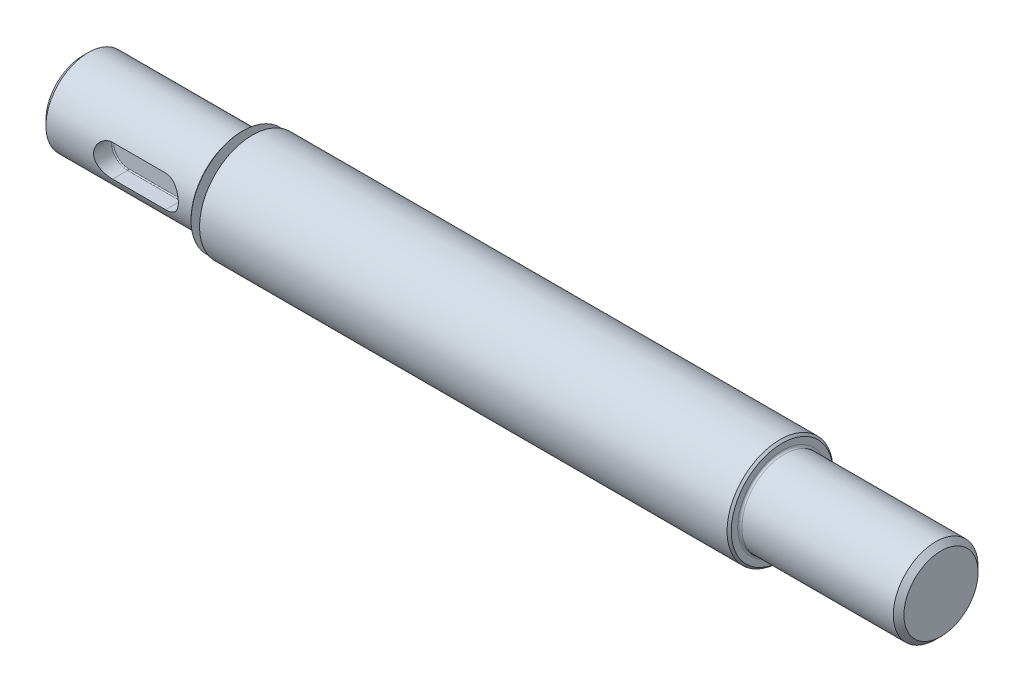
ISO-10303-21;
HEADER;
FILE_DESCRIPTION(('STEP AP214'),'2;1');
FILE_NAME('part.step','',(''),(''),'','','');
FILE_SCHEMA(('AUTOMOTIVE_DESIGN { 1 0 10303 214 1 1 1 1 }'));
ENDSEC;
DATA;
#1=APPLICATION_CONTEXT('core data for automotive mechanical design processes');
#2=APPLICATION_PROTOCOL_DEFINITION('international standard','automotive_design',2000,#1);
#3=PRODUCT_CONTEXT('',#1,'mechanical');
#4=PRODUCT('Part','Part','',(#3));
#5=PRODUCT_RELATED_PRODUCT_CATEGORY('part','',(#4));
#6=PRODUCT_DEFINITION_FORMATION('','',#4);
#7=PRODUCT_DEFINITION_CONTEXT('part definition',#1,'design');
#8=PRODUCT_DEFINITION('design','',#6,#7);
#9=PRODUCT_DEFINITION_SHAPE('','',#8);
#10=(LENGTH_UNIT() NAMED_UNIT(*) SI_UNIT(.MILLI.,.METRE.));
#11=(NAMED_UNIT(*) PLANE_ANGLE_UNIT() SI_UNIT($,.RADIAN.));
#12=(NAMED_UNIT(*) SI_UNIT($,.STERADIAN.) SOLID_ANGLE_UNIT());
#13=UNCERTAINTY_MEASURE_WITH_UNIT(LENGTH_MEASURE(1.E-05),#10,'distance_accuracy_value','');
#14=(GEOMETRIC_REPRESENTATION_CONTEXT(3) GLOBAL_UNCERTAINTY_ASSIGNED_CONTEXT((#13)) GLOBAL_UNIT_ASSIGNED_CONTEXT((#10,
#11,#12)) REPRESENTATION_CONTEXT('',''));
#15=CARTESIAN_POINT('',(0.,0.,0.));
#16=DIRECTION('',(0.,0.,1.));
#17=DIRECTION('',(1.,0.,0.));
#18=AXIS2_PLACEMENT_3D('',#15,#16,#17);
#19=CARTESIAN_POINT('',(0.,0.,0.));
#20=DIRECTION('',(-1.,0.,0.));
#21=DIRECTION('',(0.,0.,1.));
#22=AXIS2_PLACEMENT_3D('',#19,#20,#21);
#23=CYLINDRICAL_SURFACE('',#22,5.);
#24=CARTESIAN_POINT('',(65.8,0.,0.));
#25=DIRECTION('',(-1.,0.,0.));
#26=DIRECTION('',(0.,0.,1.));
#27=AXIS2_PLACEMENT_3D('',#24,#25,#26);
#28=CIRCLE('',#27,5.);
#29=CARTESIAN_POINT('',(65.8,0.,5.));
#30=VERTEX_POINT('',#29);
#31=EDGE_CURVE('E128',#30,#30,#28,.T.);
#32=ORIENTED_EDGE('',*,*,#31,.T.);
#33=EDGE_LOOP('',(#32));
#34=FACE_BOUND('',#33,.T.);
#35=CARTESIAN_POINT('',(16.,0.,0.));
#36=DIRECTION('',(-1.,0.,0.));
#37=DIRECTION('',(0.,0.,1.));
#38=AXIS2_PLACEMENT_3D('',#35,#36,#37);
#39=CIRCLE('',#38,5.);
#40=CARTESIAN_POINT('',(16.,0.,5.));
#41=VERTEX_POINT('',#40);
#42=EDGE_CURVE('E275',#41,#41,#39,.T.);
#43=ORIENTED_EDGE('',*,*,#42,.F.);
#44=EDGE_LOOP('',(#43));
#45=FACE_BOUND('',#44,.T.);
#46=ADVANCED_FACE('F37',(#34,#45),#23,.T.);
#47=CARTESIAN_POINT('',(81.,4.,0.));
#48=DIRECTION('',(-1.,0.,0.));
#49=DIRECTION('',(0.,0.,1.));
#50=AXIS2_PLACEMENT_3D('',#47,#48,#49);
#51=PLANE('',#50);
#52=CARTESIAN_POINT('',(81.,0.,0.));
#53=DIRECTION('',(-1.,0.,0.));
#54=DIRECTION('',(0.,0.,1.));
#55=AXIS2_PLACEMENT_3D('',#52,#53,#54);
#56=CIRCLE('',#55,3.5);
#57=CARTESIAN_POINT('',(81.,0.,3.5));
#58=VERTEX_POINT('',#57);
#59=EDGE_CURVE('E154',#58,#58,#56,.F.);
#60=ORIENTED_EDGE('',*,*,#59,.T.);
#61=EDGE_LOOP('',(#60));
#62=FACE_BOUND('',#61,.T.);
#63=ADVANCED_FACE('F219',(#62),#51,.F.);
#64=CARTESIAN_POINT('',(0.,0.,0.));
#65=DIRECTION('',(-1.,0.,0.));
#66=DIRECTION('',(0.,0.,1.));
#67=AXIS2_PLACEMENT_3D('',#64,#65,#66);
#68=CYLINDRICAL_SURFACE('',#67,4.);
#69=CARTESIAN_POINT('',(66.2,0.,0.));
#70=DIRECTION('',(-1.,0.,0.));
#71=DIRECTION('',(0.,0.,1.));
#72=AXIS2_PLACEMENT_3D('',#69,#70,#71);
#73=CIRCLE('',#72,4.);
#74=CARTESIAN_POINT('',(66.2,0.,4.));
#75=VERTEX_POINT('',#74);
#76=EDGE_CURVE('E166',#75,#75,#73,.F.);
#77=ORIENTED_EDGE('',*,*,#76,.T.);
#78=EDGE_LOOP('',(#77));
#79=FACE_BOUND('',#78,.T.);
#80=CARTESIAN_POINT('',(80.5,0.,0.));
#81=DIRECTION('',(-1.,0.,0.));
#82=DIRECTION('',(0.,0.,1.));
#83=AXIS2_PLACEMENT_3D('',#80,#81,#82);
#84=CIRCLE('',#83,4.);
#85=CARTESIAN_POINT('',(80.5,0.,4.));
#86=VERTEX_POINT('',#85);
#87=EDGE_CURVE('E151',#86,#86,#84,.T.);
#88=ORIENTED_EDGE('',*,*,#87,.T.);
#89=EDGE_LOOP('',(#88));
#90=FACE_BOUND('',#89,.T.);
#91=ADVANCED_FACE('F225',(#79,#90),#68,.T.);
#92=CARTESIAN_POINT('',(66.,4.,0.));
#93=DIRECTION('',(-1.,0.,0.));
#94=DIRECTION('',(0.,0.,1.));
#95=AXIS2_PLACEMENT_3D('',#92,#93,#94);
#96=PLANE('',#95);
#97=CARTESIAN_POINT('',(66.,0.,0.));
#98=DIRECTION('',(-1.,0.,0.));
#99=DIRECTION('',(0.,0.,1.));
#100=AXIS2_PLACEMENT_3D('',#97,#98,#99);
#101=CIRCLE('',#100,4.2);
#102=CARTESIAN_POINT('',(66.,0.,4.2));
#103=VERTEX_POINT('',#102);
#104=EDGE_CURVE('E163',#103,#103,#101,.T.);
#105=ORIENTED_EDGE('',*,*,#104,.T.);
#106=EDGE_LOOP('',(#105));
#107=FACE_BOUND('',#106,.T.);
#108=CARTESIAN_POINT('',(66.,0.,0.));
#109=DIRECTION('',(-1.,0.,0.));
#110=DIRECTION('',(0.,0.,1.));
#111=AXIS2_PLACEMENT_3D('',#108,#109,#110);
#112=CIRCLE('',#111,4.80000000000001);
#113=CARTESIAN_POINT('',(66.,0.,4.80000000000001));
#114=VERTEX_POINT('',#113);
#115=EDGE_CURVE('E139',#114,#114,#112,.F.);
#116=ORIENTED_EDGE('',*,*,#115,.T.);
#117=EDGE_LOOP('',(#116));
#118=FACE_BOUND('',#117,.T.);
#119=ADVANCED_FACE('F231',(#107,#118),#96,.F.);
#120=CARTESIAN_POINT('',(65.8,0.,0.));
#121=DIRECTION('',(-1.,0.,0.));
#122=DIRECTION('',(0.,0.,1.));
#123=AXIS2_PLACEMENT_3D('',#120,#121,#122);
#124=CONICAL_SURFACE('',#123,5.,0.785398163397427);
#125=ORIENTED_EDGE('',*,*,#115,.F.);
#126=EDGE_LOOP('',(#125));
#127=FACE_BOUND('',#126,.T.);
#128=ORIENTED_EDGE('',*,*,#31,.F.);
#129=EDGE_LOOP('',(#128));
#130=FACE_BOUND('',#129,.T.);
#131=ADVANCED_FACE('F234',(#127,#130),#124,.T.);
#132=CARTESIAN_POINT('',(80.5,0.,0.));
#133=DIRECTION('',(-1.,0.,0.));
#134=DIRECTION('',(0.,0.,1.));
#135=AXIS2_PLACEMENT_3D('',#132,#133,#134);
#136=CONICAL_SURFACE('',#135,4.,0.785398163397459);
#137=ORIENTED_EDGE('',*,*,#59,.F.);
#138=EDGE_LOOP('',(#137));
#139=FACE_BOUND('',#138,.T.);
#140=ORIENTED_EDGE('',*,*,#87,.F.);
#141=EDGE_LOOP('',(#140));
#142=FACE_BOUND('',#141,.T.);
#143=ADVANCED_FACE('F241',(#139,#142),#136,.T.);
#144=CARTESIAN_POINT('',(66.2,0.,0.));
#145=DIRECTION('',(-1.,0.,0.));
#146=DIRECTION('',(0.,0.,1.));
#147=AXIS2_PLACEMENT_3D('',#144,#145,#146);
#148=TOROIDAL_SURFACE('',#147,4.2,0.2);
#149=ORIENTED_EDGE('',*,*,#76,.F.);
#150=EDGE_LOOP('',(#149));
#151=FACE_BOUND('',#150,.T.);
#152=ORIENTED_EDGE('',*,*,#104,.F.);
#153=EDGE_LOOP('',(#152));
#154=FACE_BOUND('',#153,.T.);
#155=ADVANCED_FACE('F39',(#151,#154),#148,.F.);
#156=CARTESIAN_POINT('',(15.1,3.5,0.));
#157=DIRECTION('',(1.,0.,0.));
#158=DIRECTION('',(0.,0.,-1.));
#159=AXIS2_PLACEMENT_3D('',#156,#157,#158);
#160=PLANE('',#159);
#161=CARTESIAN_POINT('',(15.1,0.,0.));
#162=DIRECTION('',(1.,0.,0.));
#163=DIRECTION('',(0.,0.,-1.));
#164=AXIS2_PLACEMENT_3D('',#161,#162,#163);
#165=CIRCLE('',#164,4.89999999999999);
#166=CARTESIAN_POINT('',(15.1,0.,-4.89999999999999));
#167=VERTEX_POINT('',#166);
#168=EDGE_CURVE('E41',#167,#167,#165,.F.);
#169=ORIENTED_EDGE('',*,*,#168,.F.);
#170=EDGE_LOOP('',(#169));
#171=FACE_BOUND('',#170,.T.);
#172=CARTESIAN_POINT('',(15.1,0.,0.));
#173=DIRECTION('',(-1.,0.,0.));
#174=DIRECTION('',(0.,0.,1.));
#175=AXIS2_PLACEMENT_3D('',#172,#173,#174);
#176=CIRCLE('',#175,3.5);
#177=CARTESIAN_POINT('',(15.1,0.,3.5));
#178=VERTEX_POINT('',#177);
#179=EDGE_CURVE('E282',#178,#178,#176,.T.);
#180=ORIENTED_EDGE('',*,*,#179,.T.);
#181=EDGE_LOOP('',(#180));
#182=FACE_BOUND('',#181,.T.);
#183=ADVANCED_FACE('F379',(#171,#182),#160,.T.);
#184=CARTESIAN_POINT('',(16.,3.5,0.));
#185=DIRECTION('',(-1.,0.,0.));
#186=DIRECTION('',(0.,0.,1.));
#187=AXIS2_PLACEMENT_3D('',#184,#185,#186);
#188=PLANE('',#187);
#189=ORIENTED_EDGE('',*,*,#42,.T.);
#190=EDGE_LOOP('',(#189));
#191=FACE_BOUND('',#190,.T.);
#192=CARTESIAN_POINT('',(16.,0.,0.));
#193=DIRECTION('',(-1.,0.,0.));
#194=DIRECTION('',(0.,0.,1.));
#195=AXIS2_PLACEMENT_3D('',#192,#193,#194);
#196=CIRCLE('',#195,3.5);
#197=CARTESIAN_POINT('',(16.,0.,3.5));
#198=VERTEX_POINT('',#197);
#199=EDGE_CURVE('E277',#198,#198,#196,.T.);
#200=ORIENTED_EDGE('',*,*,#199,.F.);
#201=EDGE_LOOP('',(#200));
#202=FACE_BOUND('',#201,.T.);
#203=ADVANCED_FACE('F383',(#191,#202),#188,.T.);
#204=CARTESIAN_POINT('',(0.,0.,0.));
#205=DIRECTION('',(-1.,0.,0.));
#206=DIRECTION('',(0.,0.,1.));
#207=AXIS2_PLACEMENT_3D('',#204,#205,#206);
#208=CYLINDRICAL_SURFACE('',#207,3.5);
#209=ORIENTED_EDGE('',*,*,#199,.T.);
#210=EDGE_LOOP('',(#209));
#211=FACE_BOUND('',#210,.T.);
#212=ORIENTED_EDGE('',*,*,#179,.F.);
#213=EDGE_LOOP('',(#212));
#214=FACE_BOUND('',#213,.T.);
#215=ADVANCED_FACE('F216',(#211,#214),#208,.T.);
#216=CARTESIAN_POINT('',(0.,0.,2.2));
#217=DIRECTION('',(0.,0.,1.));
#218=DIRECTION('',(1.,0.,0.));
#219=AXIS2_PLACEMENT_3D('',#216,#217,#218);
#220=PLANE('',#219);
#221=DIRECTION('',(1.,0.,0.));
#222=VECTOR('',#221,1.);
#223=CARTESIAN_POINT('',(6.5,-1.4,2.2));
#224=LINE('',#223,#222);
#225=CARTESIAN_POINT('',(11.5,-1.4,2.2));
#226=VERTEX_POINT('',#225);
#227=CARTESIAN_POINT('',(6.5,-1.4,2.2));
#228=VERTEX_POINT('',#227);
#229=EDGE_CURVE('E117',#226,#228,#224,.F.);
#230=ORIENTED_EDGE('',*,*,#229,.F.);
#231=CARTESIAN_POINT('',(11.5,0.,2.2));
#232=DIRECTION('',(0.,0.,1.));
#233=DIRECTION('',(1.,0.,0.));
#234=AXIS2_PLACEMENT_3D('',#231,#232,#233);
#235=CIRCLE('',#234,1.4);
#236=CARTESIAN_POINT('',(11.5,1.4,2.2));
#237=VERTEX_POINT('',#236);
#238=EDGE_CURVE('E109',#237,#226,#235,.F.);
#239=ORIENTED_EDGE('',*,*,#238,.F.);
#240=DIRECTION('',(-1.,0.,0.));
#241=VECTOR('',#240,1.);
#242=CARTESIAN_POINT('',(11.5,1.4,2.2));
#243=LINE('',#242,#241);
#244=CARTESIAN_POINT('',(6.5,1.4,2.2));
#245=VERTEX_POINT('',#244);
#246=EDGE_CURVE('E94',#245,#237,#243,.F.);
#247=ORIENTED_EDGE('',*,*,#246,.F.);
#248=CARTESIAN_POINT('',(6.5,0.,2.2));
#249=DIRECTION('',(0.,0.,1.));
#250=DIRECTION('',(1.,0.,0.));
#251=AXIS2_PLACEMENT_3D('',#248,#249,#250);
#252=CIRCLE('',#251,1.4);
#253=EDGE_CURVE('E108',#228,#245,#252,.F.);
#254=ORIENTED_EDGE('',*,*,#253,.F.);
#255=EDGE_LOOP('',(#230,#239,#247,#254));
#256=FACE_BOUND('',#255,.T.);
#257=ADVANCED_FACE('F107',(#256),#220,.T.);
#258=CARTESIAN_POINT('',(0.,4.,0.));
#259=DIRECTION('',(1.,0.,0.));
#260=DIRECTION('',(0.,0.,-1.));
#261=AXIS2_PLACEMENT_3D('',#258,#259,#260);
#262=PLANE('',#261);
#263=CARTESIAN_POINT('',(0.,0.,0.));
#264=DIRECTION('',(1.,0.,0.));
#265=DIRECTION('',(0.,0.,-1.));
#266=AXIS2_PLACEMENT_3D('',#263,#264,#265);
#267=CIRCLE('',#266,3.50000000000002);
#268=CARTESIAN_POINT('',(0.,0.,-3.50000000000002));
#269=VERTEX_POINT('',#268);
#270=EDGE_CURVE('E145',#269,#269,#267,.F.);
#271=ORIENTED_EDGE('',*,*,#270,.T.);
#272=EDGE_LOOP('',(#271));
#273=FACE_BOUND('',#272,.T.);
#274=ADVANCED_FACE('F202',(#273),#262,.F.);
#275=CARTESIAN_POINT('',(6.5,0.,2.3));
#276=DIRECTION('',(0.,0.,1.));
#277=DIRECTION('',(1.,0.,0.));
#278=AXIS2_PLACEMENT_3D('',#275,#276,#277);
#279=TOROIDAL_SURFACE('',#278,1.4,0.1);
#280=CARTESIAN_POINT('',(6.5,-1.4,2.3));
#281=DIRECTION('',(-1.,0.,0.));
#282=DIRECTION('',(0.,0.,1.));
#283=AXIS2_PLACEMENT_3D('',#280,#281,#282);
#284=CIRCLE('',#283,0.1);
#285=CARTESIAN_POINT('',(6.5,-1.5,2.3));
#286=VERTEX_POINT('',#285);
#287=EDGE_CURVE('E102',#228,#286,#284,.T.);
#288=ORIENTED_EDGE('',*,*,#287,.F.);
#289=ORIENTED_EDGE('',*,*,#253,.T.);
#290=CARTESIAN_POINT('',(6.5,1.4,2.3));
#291=DIRECTION('',(-1.,0.,0.));
#292=DIRECTION('',(0.,0.,1.));
#293=AXIS2_PLACEMENT_3D('',#290,#291,#292);
#294=CIRCLE('',#293,0.1);
#295=CARTESIAN_POINT('',(6.5,1.5,2.3));
#296=VERTEX_POINT('',#295);
#297=EDGE_CURVE('E90',#296,#245,#294,.T.);
#298=ORIENTED_EDGE('',*,*,#297,.F.);
#299=CARTESIAN_POINT('',(6.5,0.,2.3));
#300=DIRECTION('',(0.,0.,1.));
#301=DIRECTION('',(1.,0.,0.));
#302=AXIS2_PLACEMENT_3D('',#299,#300,#301);
#303=CIRCLE('',#302,1.5);
#304=EDGE_CURVE('E116',#296,#286,#303,.T.);
#305=ORIENTED_EDGE('',*,*,#304,.T.);
#306=EDGE_LOOP('',(#288,#289,#298,#305));
#307=FACE_BOUND('',#306,.T.);
#308=ADVANCED_FACE('F114',(#307),#279,.F.);
#309=CARTESIAN_POINT('',(5.,-1.4,2.3));
#310=DIRECTION('',(-1.,0.,0.));
#311=DIRECTION('',(0.,-1.,0.));
#312=AXIS2_PLACEMENT_3D('',#309,#310,#311);
#313=CYLINDRICAL_SURFACE('',#312,0.1);
#314=CARTESIAN_POINT('',(11.5,-1.4,2.3));
#315=DIRECTION('',(-1.,0.,0.));
#316=DIRECTION('',(0.,0.,1.));
#317=AXIS2_PLACEMENT_3D('',#314,#315,#316);
#318=CIRCLE('',#317,0.1);
#319=CARTESIAN_POINT('',(11.5,-1.5,2.3));
#320=VERTEX_POINT('',#319);
#321=EDGE_CURVE('E133',#226,#320,#318,.T.);
#322=ORIENTED_EDGE('',*,*,#321,.F.);
#323=ORIENTED_EDGE('',*,*,#229,.T.);
#324=ORIENTED_EDGE('',*,*,#287,.T.);
#325=DIRECTION('',(1.,0.,0.));
#326=VECTOR('',#325,1.);
#327=CARTESIAN_POINT('',(11.5,-1.5,2.3));
#328=LINE('',#327,#326);
#329=EDGE_CURVE('E119',#286,#320,#328,.T.);
#330=ORIENTED_EDGE('',*,*,#329,.T.);
#331=EDGE_LOOP('',(#322,#323,#324,#330));
#332=FACE_BOUND('',#331,.T.);
#333=ADVANCED_FACE('F201',(#332),#313,.F.);
#334=CARTESIAN_POINT('',(11.5,0.,2.3));
#335=DIRECTION('',(0.,0.,1.));
#336=DIRECTION('',(1.,0.,0.));
#337=AXIS2_PLACEMENT_3D('',#334,#335,#336);
#338=TOROIDAL_SURFACE('',#337,1.4,0.1);
#339=CARTESIAN_POINT('',(11.5,1.4,2.3));
#340=DIRECTION('',(-1.,0.,0.));
#341=DIRECTION('',(0.,0.,1.));
#342=AXIS2_PLACEMENT_3D('',#339,#340,#341);
#343=CIRCLE('',#342,0.1);
#344=CARTESIAN_POINT('',(11.5,1.5,2.3));
#345=VERTEX_POINT('',#344);
#346=EDGE_CURVE('E131',#345,#237,#343,.T.);
#347=ORIENTED_EDGE('',*,*,#346,.T.);
#348=ORIENTED_EDGE('',*,*,#238,.T.);
#349=ORIENTED_EDGE('',*,*,#321,.T.);
#350=CARTESIAN_POINT('',(11.5,0.,2.3));
#351=DIRECTION('',(0.,0.,1.));
#352=DIRECTION('',(1.,0.,0.));
#353=AXIS2_PLACEMENT_3D('',#350,#351,#352);
#354=CIRCLE('',#353,1.5);
#355=EDGE_CURVE('E125',#320,#345,#354,.T.);
#356=ORIENTED_EDGE('',*,*,#355,.T.);
#357=EDGE_LOOP('',(#347,#348,#349,#356));
#358=FACE_BOUND('',#357,.T.);
#359=ADVANCED_FACE('F205',(#358),#338,.F.);
#360=CARTESIAN_POINT('',(5.,1.4,2.3));
#361=DIRECTION('',(1.,0.,0.));
#362=DIRECTION('',(0.,1.,0.));
#363=AXIS2_PLACEMENT_3D('',#360,#361,#362);
#364=CYLINDRICAL_SURFACE('',#363,0.1);
#365=ORIENTED_EDGE('',*,*,#346,.F.);
#366=DIRECTION('',(-1.,0.,0.));
#367=VECTOR('',#366,1.);
#368=CARTESIAN_POINT('',(6.5,1.5,2.3));
#369=LINE('',#368,#367);
#370=EDGE_CURVE('E97',#345,#296,#369,.T.);
#371=ORIENTED_EDGE('',*,*,#370,.T.);
#372=ORIENTED_EDGE('',*,*,#297,.T.);
#373=ORIENTED_EDGE('',*,*,#246,.T.);
#374=EDGE_LOOP('',(#365,#371,#372,#373));
#375=FACE_BOUND('',#374,.T.);
#376=ADVANCED_FACE('F93',(#375),#364,.F.);
#377=CARTESIAN_POINT('',(0.,0.,0.));
#378=DIRECTION('',(1.,0.,0.));
#379=DIRECTION('',(0.,0.,-1.));
#380=AXIS2_PLACEMENT_3D('',#377,#378,#379);
#381=CONICAL_SURFACE('',#380,3.50000000000002,0.785398163397435);
#382=CARTESIAN_POINT('',(0.499999999999995,0.,0.));
#383=DIRECTION('',(1.,0.,0.));
#384=DIRECTION('',(0.,0.,-1.));
#385=AXIS2_PLACEMENT_3D('',#382,#383,#384);
#386=CIRCLE('',#385,4.);
#387=CARTESIAN_POINT('',(0.499999999999995,0.,-4.));
#388=VERTEX_POINT('',#387);
#389=EDGE_CURVE('E148',#388,#388,#386,.T.);
#390=ORIENTED_EDGE('',*,*,#389,.F.);
#391=EDGE_LOOP('',(#390));
#392=FACE_BOUND('',#391,.T.);
#393=ORIENTED_EDGE('',*,*,#270,.F.);
#394=EDGE_LOOP('',(#393));
#395=FACE_BOUND('',#394,.T.);
#396=ADVANCED_FACE('F191',(#392,#395),#381,.T.);
#397=CARTESIAN_POINT('',(6.5,0.,2.2));
#398=DIRECTION('',(0.,0.,1.));
#399=DIRECTION('',(1.,0.,0.));
#400=AXIS2_PLACEMENT_3D('',#397,#398,#399);
#401=CYLINDRICAL_SURFACE('',#400,1.5);
#402=DIRECTION('',(0.,0.,1.));
#403=VECTOR('',#402,1.);
#404=CARTESIAN_POINT('',(6.5,-1.5,2.2));
#405=LINE('',#404,#403);
#406=CARTESIAN_POINT('',(6.5,-1.5,3.70809924354783));
#407=VERTEX_POINT('',#406);
#408=EDGE_CURVE('E288',#407,#286,#405,.F.);
#409=ORIENTED_EDGE('',*,*,#408,.T.);
#410=ORIENTED_EDGE('',*,*,#304,.F.);
#411=DIRECTION('',(0.,0.,1.));
#412=VECTOR('',#411,1.);
#413=CARTESIAN_POINT('',(6.5,1.5,2.2));
#414=LINE('',#413,#412);
#415=CARTESIAN_POINT('',(6.5,1.5,3.70809924354783));
#416=VERTEX_POINT('',#415);
#417=EDGE_CURVE('E136',#296,#416,#414,.T.);
#418=ORIENTED_EDGE('',*,*,#417,.T.);
#419=CARTESIAN_POINT('',(6.5,-1.5,3.70809924354783));
#420=CARTESIAN_POINT('',(6.45940746697043,-1.50000149729856,3.70809443619347));
#421=CARTESIAN_POINT('',(6.41883607071224,-1.49835118206537,3.70876663375751));
#422=CARTESIAN_POINT('',(6.33801546127266,-1.49177905295192,3.71141673218275));
#423=CARTESIAN_POINT('',(6.29776614450681,-1.48685833749724,3.7133941946446));
#424=CARTESIAN_POINT('',(6.17823278427476,-1.46729482367934,3.72118975606221));
#425=CARTESIAN_POINT('',(6.09980033977284,-1.44784998767984,3.72887188404209));
#426=CARTESIAN_POINT('',(5.94763248148488,-1.39690233043372,3.74825217997877));
#427=CARTESIAN_POINT('',(5.87389317095925,-1.36540966903062,3.7599469632381));
#428=CARTESIAN_POINT('',(5.73266647993866,-1.29134097725474,3.7860238820009));
#429=CARTESIAN_POINT('',(5.66518427798758,-1.24875587557702,3.80040821426565));
#430=CARTESIAN_POINT('',(5.53510808005929,-1.15146603872017,3.83103589828726));
#431=CARTESIAN_POINT('',(5.47286998568183,-1.09630269892843,3.84733374054252));
#432=CARTESIAN_POINT('',(5.35827640698257,-0.976394584974256,3.8794978206844));
#433=CARTESIAN_POINT('',(5.3059228356596,-0.911647960429701,3.8953639745168));
#434=CARTESIAN_POINT('',(5.21085978574637,-0.771693719740036,3.92552893891844));
#435=CARTESIAN_POINT('',(5.1685393993163,-0.696204968758628,3.93975598379754));
#436=CARTESIAN_POINT('',(5.09734808891712,-0.538553622304924,3.96438035322528));
#437=CARTESIAN_POINT('',(5.06847215051311,-0.456393528521805,3.97477910532575));
#438=CARTESIAN_POINT('',(5.02624228117841,-0.291490050670588,3.99018690464435));
#439=CARTESIAN_POINT('',(5.01227261569605,-0.208924649211909,3.99540906103972));
#440=CARTESIAN_POINT('',(4.99827880206799,-0.0424658385808873,4.00064014015321));
#441=CARTESIAN_POINT('',(4.99825036319808,0.0414271540462111,4.00065066686691));
#442=CARTESIAN_POINT('',(5.01178180622896,0.203744100069408,3.99559264174045));
#443=CARTESIAN_POINT('',(5.02466947520742,0.282233282883083,3.99077535168083));
#444=CARTESIAN_POINT('',(5.06253627111217,0.435840275995115,3.97693262269583));
#445=CARTESIAN_POINT('',(5.08751608464632,0.51095789458693,3.96790694481372));
#446=CARTESIAN_POINT('',(5.14917039259576,0.656988917196577,3.94637770601049));
#447=CARTESIAN_POINT('',(5.18600984092341,0.727825198012179,3.93382542785069));
#448=CARTESIAN_POINT('',(5.27019203757313,0.862486444375065,3.90651314175191));
#449=CARTESIAN_POINT('',(5.31753820178733,0.926309119580088,3.89175241632298));
#450=CARTESIAN_POINT('',(5.42462313149112,1.04908600084313,3.86052643048223));
#451=CARTESIAN_POINT('',(5.48492438433501,1.10753779261244,3.84401196825707));
#452=CARTESIAN_POINT('',(5.61458413437778,1.21369725159035,3.81182684214318));
#453=CARTESIAN_POINT('',(5.68394617464743,1.26140069584828,3.79615651174147));
#454=CARTESIAN_POINT('',(5.83175802841381,1.34567998313248,3.7671186794103));
#455=CARTESIAN_POINT('',(5.91037840566762,1.38197861969245,3.75381153298453));
#456=CARTESIAN_POINT('',(6.07320632184189,1.44059114536973,3.73171449181344));
#457=CARTESIAN_POINT('',(6.15740420493295,1.46292853893353,3.72291700934123));
#458=CARTESIAN_POINT('',(6.28538101764776,1.48519272209728,3.7140622685257));
#459=CARTESIAN_POINT('',(6.32810232952057,1.49074028414002,3.71183476402566));
#460=CARTESIAN_POINT('',(6.41387406887173,1.49814308997677,3.70885093143241));
#461=CARTESIAN_POINT('',(6.45692415302942,1.50000176547338,3.70809323601798));
#462=CARTESIAN_POINT('',(6.5,1.5,3.70809924354783));
#463=B_SPLINE_CURVE_WITH_KNOTS('',3,(#419,#420,#421,#422,#423,#424,#425,#426,#427,#428,#429,
#430,#431,#432,#433,#434,#435,#436,#437,#438,#439,#440,#441,#442,#443,#444,#445,#446,#447,#448,
#449,#450,#451,#452,#453,#454,#455,#456,#457,#458,#459,#460,#461,#462),.UNSPECIFIED.,.F.,.F.,(4,
2,2,2,2,2,2,2,2,2,2,2,2,2,2,2,2,2,2,2,2,4),(0.,0.121697465666186,0.243354077586418,
0.485593064591345,0.727628221922015,0.969861938431283,1.22298027419406,1.47614754705134,
1.73793539440997,1.9996255232324,2.25002925199203,2.50035591335681,2.73829765644058,
2.97625291175452,3.21767225141682,3.45917019544674,3.7147799395163,3.97048993642582,
4.23200510445915,4.49307880432491,4.62233004062784,4.75146098044213),.UNSPECIFIED.);
#464=EDGE_CURVE('E169',#407,#416,#463,.T.);
#465=ORIENTED_EDGE('',*,*,#464,.F.);
#466=EDGE_LOOP('',(#409,#410,#418,#465));
#467=FACE_BOUND('',#466,.T.);
#468=ADVANCED_FACE('F186',(#467),#401,.F.);
#469=CARTESIAN_POINT('',(5.,-1.5,2.2));
#470=DIRECTION('',(0.,-1.,0.));
#471=DIRECTION('',(1.,0.,0.));
#472=AXIS2_PLACEMENT_3D('',#469,#470,#471);
#473=PLANE('',#472);
#474=DIRECTION('',(0.,0.,1.));
#475=VECTOR('',#474,1.);
#476=CARTESIAN_POINT('',(11.5,-1.5,2.2));
#477=LINE('',#476,#475);
#478=CARTESIAN_POINT('',(11.5,-1.5,3.70809924354783));
#479=VERTEX_POINT('',#478);
#480=EDGE_CURVE('E111',#320,#479,#477,.T.);
#481=ORIENTED_EDGE('',*,*,#480,.F.);
#482=ORIENTED_EDGE('',*,*,#329,.F.);
#483=ORIENTED_EDGE('',*,*,#408,.F.);
#484=DIRECTION('',(-1.,0.,0.));
#485=VECTOR('',#484,1.);
#486=CARTESIAN_POINT('',(0.,-1.5,3.70809924354783));
#487=LINE('',#486,#485);
#488=EDGE_CURVE('E11',#479,#407,#487,.T.);
#489=ORIENTED_EDGE('',*,*,#488,.F.);
#490=EDGE_LOOP('',(#481,#482,#483,#489));
#491=FACE_BOUND('',#490,.T.);
#492=ADVANCED_FACE('F190',(#491),#473,.F.);
#493=CARTESIAN_POINT('',(11.5,0.,4.));
#494=DIRECTION('',(0.,0.,1.));
#495=DIRECTION('',(1.,0.,0.));
#496=AXIS2_PLACEMENT_3D('',#493,#494,#495);
#497=CYLINDRICAL_SURFACE('',#496,1.5);
#498=DIRECTION('',(0.,0.,1.));
#499=VECTOR('',#498,1.);
#500=CARTESIAN_POINT('',(11.5,1.5,2.2));
#501=LINE('',#500,#499);
#502=CARTESIAN_POINT('',(11.5,1.5,3.70809924354783));
#503=VERTEX_POINT('',#502);
#504=EDGE_CURVE('E290',#503,#345,#501,.F.);
#505=ORIENTED_EDGE('',*,*,#504,.T.);
#506=ORIENTED_EDGE('',*,*,#355,.F.);
#507=ORIENTED_EDGE('',*,*,#480,.T.);
#508=CARTESIAN_POINT('',(11.5,1.5,3.70809924354783));
#509=CARTESIAN_POINT('',(11.5405925330296,1.50000149729856,3.70809443619347));
#510=CARTESIAN_POINT('',(11.5811639292878,1.49835118206537,3.70876663375751));
#511=CARTESIAN_POINT('',(11.6619845387273,1.49177905295192,3.71141673218275));
#512=CARTESIAN_POINT('',(11.7022338554932,1.48685833749724,3.7133941946446));
#513=CARTESIAN_POINT('',(11.8217672157252,1.46729482367934,3.72118975606221));
#514=CARTESIAN_POINT('',(11.9001996602272,1.44784998767984,3.72887188404209));
#515=CARTESIAN_POINT('',(12.0523675185151,1.39690233043372,3.74825217997877));
#516=CARTESIAN_POINT('',(12.1261068290407,1.36540966903062,3.7599469632381));
#517=CARTESIAN_POINT('',(12.2673335200613,1.29134097725474,3.7860238820009));
#518=CARTESIAN_POINT('',(12.3348157220124,1.24875587557702,3.80040821426565));
#519=CARTESIAN_POINT('',(12.4648919199407,1.15146603872017,3.83103589828726));
#520=CARTESIAN_POINT('',(12.5271300143182,1.09630269892843,3.84733374054252));
#521=CARTESIAN_POINT('',(12.6417235930174,0.976394584974256,3.8794978206844));
#522=CARTESIAN_POINT('',(12.6940771643404,0.9116479604297,3.8953639745168));
#523=CARTESIAN_POINT('',(12.7891402142536,0.771693719740035,3.92552893891844));
#524=CARTESIAN_POINT('',(12.8314606006837,0.696204968758627,3.93975598379754));
#525=CARTESIAN_POINT('',(12.9026519110829,0.538553622304924,3.96438035322528));
#526=CARTESIAN_POINT('',(12.9315278494869,0.456393528521806,3.97477910532575));
#527=CARTESIAN_POINT('',(12.9737577188216,0.291490050670589,3.99018690464435));
#528=CARTESIAN_POINT('',(12.987727384304,0.20892464921191,3.99540906103972));
#529=CARTESIAN_POINT('',(13.001721197932,0.042465838580888,4.00064014015321));
#530=CARTESIAN_POINT('',(13.0017496368019,-0.0414271540462105,4.00065066686691));
#531=CARTESIAN_POINT('',(12.988218193771,-0.203744100069407,3.99559264174045));
#532=CARTESIAN_POINT('',(12.9753305247926,-0.282233282883083,3.99077535168083));
#533=CARTESIAN_POINT('',(12.9374637288878,-0.435840275995114,3.97693262269583));
#534=CARTESIAN_POINT('',(12.9124839153537,-0.510957894586929,3.96790694481372));
#535=CARTESIAN_POINT('',(12.8508296074042,-0.656988917196576,3.94637770601049));
#536=CARTESIAN_POINT('',(12.8139901590766,-0.727825198012177,3.93382542785069));
#537=CARTESIAN_POINT('',(12.7298079624269,-0.862486444375063,3.90651314175191));
#538=CARTESIAN_POINT('',(12.6824617982127,-0.926309119580086,3.89175241632298));
#539=CARTESIAN_POINT('',(12.5753768685089,-1.04908600084312,3.86052643048222));
#540=CARTESIAN_POINT('',(12.515075615665,-1.10753779261244,3.84401196825707));
#541=CARTESIAN_POINT('',(12.3854158656222,-1.21369725159035,3.81182684214318));
#542=CARTESIAN_POINT('',(12.3160538253526,-1.26140069584828,3.79615651174147));
#543=CARTESIAN_POINT('',(12.1682419715862,-1.34567998313248,3.7671186794103));
#544=CARTESIAN_POINT('',(12.0896215943324,-1.38197861969245,3.75381153298453));
#545=CARTESIAN_POINT('',(11.9267936781581,-1.44059114536973,3.73171449181344));
#546=CARTESIAN_POINT('',(11.8425957950671,-1.46292853893353,3.72291700934124));
#547=CARTESIAN_POINT('',(11.7146189823522,-1.48519272209728,3.7140622685257));
#548=CARTESIAN_POINT('',(11.6718976704794,-1.49074028414002,3.71183476402566));
#549=CARTESIAN_POINT('',(11.5861259311283,-1.49814308997677,3.70885093143241));
#550=CARTESIAN_POINT('',(11.5430758469706,-1.50000176547338,3.70809323601798));
#551=CARTESIAN_POINT('',(11.5,-1.5,3.70809924354783));
#552=B_SPLINE_CURVE_WITH_KNOTS('',3,(#508,#509,#510,#511,#512,#513,#514,#515,#516,#517,#518,
#519,#520,#521,#522,#523,#524,#525,#526,#527,#528,#529,#530,#531,#532,#533,#534,#535,#536,#537,
#538,#539,#540,#541,#542,#543,#544,#545,#546,#547,#548,#549,#550,#551),.UNSPECIFIED.,.F.,.F.,(4,
2,2,2,2,2,2,2,2,2,2,2,2,2,2,2,2,2,2,2,2,4),(0.,0.121697465666187,0.24335407758642,
0.485593064591345,0.727628221922014,0.969861938431283,1.22298027419407,1.47614754705134,
1.73793539440997,1.9996255232324,2.25002925199202,2.50035591335681,2.73829765644058,
2.97625291175452,3.21767225141682,3.45917019544674,3.7147799395163,3.97048993642582,
4.23200510445915,4.49307880432491,4.62233004062784,4.75146098044213),.UNSPECIFIED.);
#553=EDGE_CURVE('E53',#503,#479,#552,.T.);
#554=ORIENTED_EDGE('',*,*,#553,.F.);
#555=EDGE_LOOP('',(#505,#506,#507,#554));
#556=FACE_BOUND('',#555,.T.);
#557=ADVANCED_FACE('F195',(#556),#497,.F.);
#558=CARTESIAN_POINT('',(5.,1.5,2.2));
#559=DIRECTION('',(0.,1.,0.));
#560=DIRECTION('',(-1.,0.,0.));
#561=AXIS2_PLACEMENT_3D('',#558,#559,#560);
#562=PLANE('',#561);
#563=ORIENTED_EDGE('',*,*,#417,.F.);
#564=ORIENTED_EDGE('',*,*,#370,.F.);
#565=ORIENTED_EDGE('',*,*,#504,.F.);
#566=DIRECTION('',(-1.,0.,0.));
#567=VECTOR('',#566,1.);
#568=CARTESIAN_POINT('',(0.,1.5,3.70809924354783));
#569=LINE('',#568,#567);
#570=EDGE_CURVE('E46',#416,#503,#569,.F.);
#571=ORIENTED_EDGE('',*,*,#570,.F.);
#572=EDGE_LOOP('',(#563,#564,#565,#571));
#573=FACE_BOUND('',#572,.T.);
#574=ADVANCED_FACE('F193',(#573),#562,.F.);
#575=CARTESIAN_POINT('',(0.,0.,0.));
#576=DIRECTION('',(-1.,0.,0.));
#577=DIRECTION('',(0.,0.,1.));
#578=AXIS2_PLACEMENT_3D('',#575,#576,#577);
#579=CYLINDRICAL_SURFACE('',#578,4.);
#580=ORIENTED_EDGE('',*,*,#570,.T.);
#581=ORIENTED_EDGE('',*,*,#553,.T.);
#582=ORIENTED_EDGE('',*,*,#488,.T.);
#583=ORIENTED_EDGE('',*,*,#464,.T.);
#584=EDGE_LOOP('',(#580,#581,#582,#583));
#585=FACE_BOUND('',#584,.T.);
#586=CARTESIAN_POINT('',(14.8,0.,0.));
#587=DIRECTION('',(1.,0.,0.));
#588=DIRECTION('',(0.,0.,-1.));
#589=AXIS2_PLACEMENT_3D('',#586,#587,#588);
#590=CIRCLE('',#589,4.);
#591=CARTESIAN_POINT('',(14.8,0.,-4.));
#592=VERTEX_POINT('',#591);
#593=EDGE_CURVE('E157',#592,#592,#590,.F.);
#594=ORIENTED_EDGE('',*,*,#593,.T.);
#595=EDGE_LOOP('',(#594));
#596=FACE_BOUND('',#595,.T.);
#597=ORIENTED_EDGE('',*,*,#389,.T.);
#598=EDGE_LOOP('',(#597));
#599=FACE_BOUND('',#598,.T.);
#600=ADVANCED_FACE('F182',(#585,#596,#599),#579,.T.);
#601=CARTESIAN_POINT('',(14.8,0.,0.));
#602=DIRECTION('',(1.,0.,0.));
#603=DIRECTION('',(0.,0.,-1.));
#604=AXIS2_PLACEMENT_3D('',#601,#602,#603);
#605=TOROIDAL_SURFACE('',#604,4.2,0.2);
#606=CARTESIAN_POINT('',(15.,0.,0.));
#607=DIRECTION('',(1.,0.,0.));
#608=DIRECTION('',(0.,0.,-1.));
#609=AXIS2_PLACEMENT_3D('',#606,#607,#608);
#610=CIRCLE('',#609,4.2);
#611=CARTESIAN_POINT('',(15.,0.,-4.2));
#612=VERTEX_POINT('',#611);
#613=EDGE_CURVE('E160',#612,#612,#610,.T.);
#614=ORIENTED_EDGE('',*,*,#613,.F.);
#615=EDGE_LOOP('',(#614));
#616=FACE_BOUND('',#615,.T.);
#617=ORIENTED_EDGE('',*,*,#593,.F.);
#618=EDGE_LOOP('',(#617));
#619=FACE_BOUND('',#618,.T.);
#620=ADVANCED_FACE('F252',(#616,#619),#605,.F.);
#621=CARTESIAN_POINT('',(15.,4.99999999999999,0.));
#622=DIRECTION('',(1.,0.,0.));
#623=DIRECTION('',(0.,0.,-1.));
#624=AXIS2_PLACEMENT_3D('',#621,#622,#623);
#625=PLANE('',#624);
#626=ORIENTED_EDGE('',*,*,#613,.T.);
#627=EDGE_LOOP('',(#626));
#628=FACE_BOUND('',#627,.T.);
#629=CARTESIAN_POINT('',(15.,0.,0.));
#630=DIRECTION('',(1.,0.,0.));
#631=DIRECTION('',(0.,0.,-1.));
#632=AXIS2_PLACEMENT_3D('',#629,#630,#631);
#633=CIRCLE('',#632,4.79999999999999);
#634=CARTESIAN_POINT('',(15.,0.,-4.79999999999999));
#635=VERTEX_POINT('',#634);
#636=EDGE_CURVE('E142',#635,#635,#633,.F.);
#637=ORIENTED_EDGE('',*,*,#636,.T.);
#638=EDGE_LOOP('',(#637));
#639=FACE_BOUND('',#638,.T.);
#640=ADVANCED_FACE('F230',(#628,#639),#625,.F.);
#641=CARTESIAN_POINT('',(15.,0.,0.));
#642=DIRECTION('',(1.,0.,0.));
#643=DIRECTION('',(0.,0.,-1.));
#644=AXIS2_PLACEMENT_3D('',#641,#642,#643);
#645=CONICAL_SURFACE('',#644,4.79999999999999,0.785398163397435);
#646=ORIENTED_EDGE('',*,*,#636,.F.);
#647=EDGE_LOOP('',(#646));
#648=FACE_BOUND('',#647,.T.);
#649=ORIENTED_EDGE('',*,*,#168,.T.);
#650=EDGE_LOOP('',(#649));
#651=FACE_BOUND('',#650,.T.);
#652=ADVANCED_FACE('F243',(#648,#651),#645,.T.);
#653=CLOSED_SHELL('',(#46,#63,#91,#119,#131,#143,#155,#183,#203,#215,#257,#274,#308,#333,#359,
#376,#396,#468,#492,#557,#574,#600,#620,#640,#652));
#654=MANIFOLD_SOLID_BREP('B2',#653);
#655=ADVANCED_BREP_SHAPE_REPRESENTATION('',(#18,#654),#14);
#656=SHAPE_DEFINITION_REPRESENTATION(#9,#655);
ENDSEC;
END-ISO-10303-21;
